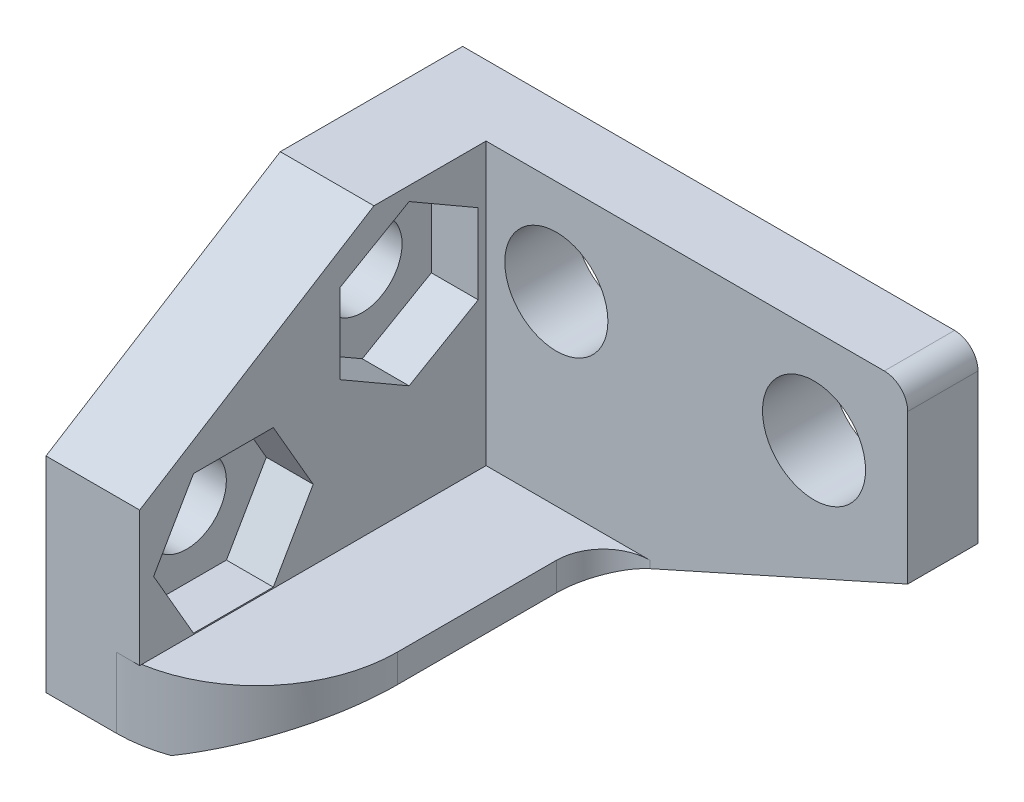
ISO-10303-21;
HEADER;
FILE_DESCRIPTION(('STEP AP214'),'2;1');
FILE_NAME('part.step','',(''),(''),'','','');
FILE_SCHEMA(('AUTOMOTIVE_DESIGN { 1 0 10303 214 1 1 1 1 }'));
ENDSEC;
DATA;
#1=APPLICATION_CONTEXT('core data for automotive mechanical design processes');
#2=APPLICATION_PROTOCOL_DEFINITION('international standard','automotive_design',2000,#1);
#3=PRODUCT_CONTEXT('',#1,'mechanical');
#4=PRODUCT('Part','Part','',(#3));
#5=PRODUCT_RELATED_PRODUCT_CATEGORY('part','',(#4));
#6=PRODUCT_DEFINITION_FORMATION('','',#4);
#7=PRODUCT_DEFINITION_CONTEXT('part definition',#1,'design');
#8=PRODUCT_DEFINITION('design','',#6,#7);
#9=PRODUCT_DEFINITION_SHAPE('','',#8);
#10=(LENGTH_UNIT() NAMED_UNIT(*) SI_UNIT(.MILLI.,.METRE.));
#11=(NAMED_UNIT(*) PLANE_ANGLE_UNIT() SI_UNIT($,.RADIAN.));
#12=(NAMED_UNIT(*) SI_UNIT($,.STERADIAN.) SOLID_ANGLE_UNIT());
#13=UNCERTAINTY_MEASURE_WITH_UNIT(LENGTH_MEASURE(1.E-05),#10,'distance_accuracy_value','');
#14=(GEOMETRIC_REPRESENTATION_CONTEXT(3) GLOBAL_UNCERTAINTY_ASSIGNED_CONTEXT((#13)) GLOBAL_UNIT_ASSIGNED_CONTEXT((#10,
#11,#12)) REPRESENTATION_CONTEXT('',''));
#15=CARTESIAN_POINT('',(0.,0.,0.));
#16=DIRECTION('',(0.,0.,1.));
#17=DIRECTION('',(1.,0.,0.));
#18=AXIS2_PLACEMENT_3D('',#15,#16,#17);
#19=CARTESIAN_POINT('',(-1.76336633663367,3.93366336633664,0.));
#20=DIRECTION('',(-0.409055904092909,0.912509324514951,0.));
#21=DIRECTION('',(-0.912509324514951,-0.409055904092909,0.));
#22=AXIS2_PLACEMENT_3D('',#19,#20,#21);
#23=PLANE('',#22);
#24=DIRECTION('',(-0.912509324514951,-0.409055904092909,0.));
#25=VECTOR('',#24,1.);
#26=CARTESIAN_POINT('',(-1.76336633663367,3.93366336633664,2.));
#27=LINE('',#26,#25);
#28=CARTESIAN_POINT('',(1.99999999999999,5.62068965517242,2.));
#29=VERTEX_POINT('',#28);
#30=CARTESIAN_POINT('',(-15.,-1.99999999999999,2.));
#31=VERTEX_POINT('',#30);
#32=EDGE_CURVE('E337',#29,#31,#27,.T.);
#33=ORIENTED_EDGE('',*,*,#32,.F.);
#34=DIRECTION('',(0.,0.,-1.));
#35=VECTOR('',#34,1.);
#36=CARTESIAN_POINT('',(1.99999999999999,5.62068965517242,0.));
#37=LINE('',#36,#35);
#38=CARTESIAN_POINT('',(1.99999999999999,5.62068965517242,5.));
#39=VERTEX_POINT('',#38);
#40=EDGE_CURVE('E354',#39,#29,#37,.T.);
#41=ORIENTED_EDGE('',*,*,#40,.F.);
#42=DIRECTION('',(-0.912509324514951,-0.409055904092909,0.));
#43=VECTOR('',#42,1.);
#44=CARTESIAN_POINT('',(-1.76336633663367,3.93366336633664,5.));
#45=LINE('',#44,#43);
#46=CARTESIAN_POINT('',(-9.,0.689655172413803,5.));
#47=VERTEX_POINT('',#46);
#48=EDGE_CURVE('E366',#39,#47,#45,.T.);
#49=ORIENTED_EDGE('',*,*,#48,.T.);
#50=CARTESIAN_POINT('',(-9.,0.689655172413805,7.));
#51=DIRECTION('',(-0.409055904092909,0.912509324514951,0.));
#52=DIRECTION('',(-0.912509324514951,-0.409055904092909,0.));
#53=AXIS2_PLACEMENT_3D('',#50,#51,#52);
#54=ELLIPSE('',#53,2.1917584251132,2.);
#55=CARTESIAN_POINT('',(-11.,-0.206896551724126,7.));
#56=VERTEX_POINT('',#55);
#57=EDGE_CURVE('E400',#47,#56,#54,.T.);
#58=ORIENTED_EDGE('',*,*,#57,.T.);
#59=DIRECTION('',(0.,0.,-1.));
#60=VECTOR('',#59,1.);
#61=CARTESIAN_POINT('',(-11.,-0.206896551724126,19.7866151357743));
#62=LINE('',#61,#60);
#63=CARTESIAN_POINT('',(-11.,-0.206896551724126,13.7866151357743));
#64=VERTEX_POINT('',#63);
#65=EDGE_CURVE('E343',#64,#56,#62,.T.);
#66=ORIENTED_EDGE('',*,*,#65,.F.);
#67=CARTESIAN_POINT('',(-17.,-2.89655172413792,13.7866151357743));
#68=DIRECTION('',(-0.409055904092909,0.912509324514951,0.));
#69=DIRECTION('',(0.912509324514951,0.409055904092909,0.));
#70=AXIS2_PLACEMENT_3D('',#67,#68,#69);
#71=ELLIPSE('',#70,6.5752752753396,6.);
#72=CARTESIAN_POINT('',(-15.,-1.99999999999999,19.4434693852667));
#73=VERTEX_POINT('',#72);
#74=EDGE_CURVE('E390',#64,#73,#71,.F.);
#75=ORIENTED_EDGE('',*,*,#74,.T.);
#76=DIRECTION('',(0.,0.,1.));
#77=VECTOR('',#76,1.);
#78=CARTESIAN_POINT('',(-15.,-1.99999999999999,0.));
#79=LINE('',#78,#77);
#80=EDGE_CURVE('E369',#31,#73,#79,.T.);
#81=ORIENTED_EDGE('',*,*,#80,.F.);
#82=EDGE_LOOP('',(#33,#41,#49,#58,#66,#75,#81));
#83=FACE_BOUND('',#82,.T.);
#84=ADVANCED_FACE('F41',(#83),#23,.F.);
#85=CARTESIAN_POINT('',(2.97851411655218,13.,0.));
#86=DIRECTION('',(0.,-1.,0.));
#87=DIRECTION('',(1.,0.,0.));
#88=AXIS2_PLACEMENT_3D('',#85,#86,#87);
#89=PLANE('',#88);
#90=DIRECTION('',(0.,0.,1.));
#91=VECTOR('',#90,1.);
#92=CARTESIAN_POINT('',(-16.,13.,5.));
#93=LINE('',#92,#91);
#94=CARTESIAN_POINT('',(-16.,13.,5.));
#95=VERTEX_POINT('',#94);
#96=CARTESIAN_POINT('',(-16.,13.,9.78661513577426));
#97=VERTEX_POINT('',#96);
#98=EDGE_CURVE('E318',#95,#97,#93,.T.);
#99=ORIENTED_EDGE('',*,*,#98,.F.);
#100=DIRECTION('',(1.,0.,0.));
#101=VECTOR('',#100,1.);
#102=CARTESIAN_POINT('',(0.,13.,5.));
#103=LINE('',#102,#101);
#104=CARTESIAN_POINT('',(0.999999999999988,13.,5.));
#105=VERTEX_POINT('',#104);
#106=EDGE_CURVE('E58',#95,#105,#103,.T.);
#107=ORIENTED_EDGE('',*,*,#106,.T.);
#108=DIRECTION('',(0.,0.,1.));
#109=VECTOR('',#108,1.);
#110=CARTESIAN_POINT('',(0.999999999999988,13.,0.));
#111=LINE('',#110,#109);
#112=CARTESIAN_POINT('',(0.999999999999988,13.,2.));
#113=VERTEX_POINT('',#112);
#114=EDGE_CURVE('E378',#105,#113,#111,.F.);
#115=ORIENTED_EDGE('',*,*,#114,.T.);
#116=DIRECTION('',(1.,0.,0.));
#117=VECTOR('',#116,1.);
#118=CARTESIAN_POINT('',(2.97851411655218,13.,2.));
#119=LINE('',#118,#117);
#120=CARTESIAN_POINT('',(-20.,13.,2.));
#121=VERTEX_POINT('',#120);
#122=EDGE_CURVE('E335',#121,#113,#119,.T.);
#123=ORIENTED_EDGE('',*,*,#122,.F.);
#124=DIRECTION('',(0.,0.,1.));
#125=VECTOR('',#124,1.);
#126=CARTESIAN_POINT('',(-20.,13.,0.));
#127=LINE('',#126,#125);
#128=CARTESIAN_POINT('',(-20.,13.,9.78661513577425));
#129=VERTEX_POINT('',#128);
#130=EDGE_CURVE('E360',#121,#129,#127,.T.);
#131=ORIENTED_EDGE('',*,*,#130,.T.);
#132=DIRECTION('',(1.,0.,0.));
#133=VECTOR('',#132,1.);
#134=CARTESIAN_POINT('',(2.97851411655218,13.,9.78661513577425));
#135=LINE('',#134,#133);
#136=EDGE_CURVE('E12',#129,#97,#135,.T.);
#137=ORIENTED_EDGE('',*,*,#136,.T.);
#138=EDGE_LOOP('',(#99,#107,#115,#123,#131,#137));
#139=FACE_BOUND('',#138,.T.);
#140=ADVANCED_FACE('F418',(#139),#89,.F.);
#141=CARTESIAN_POINT('',(-20.,25.,5.));
#142=DIRECTION('',(1.,0.,0.));
#143=DIRECTION('',(0.,1.,0.));
#144=AXIS2_PLACEMENT_3D('',#141,#142,#143);
#145=PLANE('',#144);
#146=CARTESIAN_POINT('',(-20.,4.00000000000001,15.7866151357743));
#147=DIRECTION('',(-1.,0.,0.));
#148=DIRECTION('',(0.,-1.,0.));
#149=AXIS2_PLACEMENT_3D('',#146,#147,#148);
#150=CIRCLE('',#149,1.7);
#151=CARTESIAN_POINT('',(-20.,2.30000000000001,15.7866151357743));
#152=VERTEX_POINT('',#151);
#153=EDGE_CURVE('E499',#152,#152,#150,.T.);
#154=ORIENTED_EDGE('',*,*,#153,.F.);
#155=EDGE_LOOP('',(#154));
#156=FACE_BOUND('',#155,.T.);
#157=CARTESIAN_POINT('',(-20.,9.00000000000001,8.28661513577429));
#158=DIRECTION('',(-1.,0.,0.));
#159=DIRECTION('',(0.,-1.,0.));
#160=AXIS2_PLACEMENT_3D('',#157,#158,#159);
#161=CIRCLE('',#160,1.7);
#162=CARTESIAN_POINT('',(-20.,7.30000000000001,8.28661513577429));
#163=VERTEX_POINT('',#162);
#164=EDGE_CURVE('E239',#163,#163,#161,.T.);
#165=ORIENTED_EDGE('',*,*,#164,.F.);
#166=EDGE_LOOP('',(#165));
#167=FACE_BOUND('',#166,.T.);
#168=DIRECTION('',(0.,-1.,0.));
#169=VECTOR('',#168,1.);
#170=CARTESIAN_POINT('',(-20.,-1.99999999999999,19.7866151357743));
#171=LINE('',#170,#169);
#172=CARTESIAN_POINT('',(-20.,6.75130648090674,19.7866151357743));
#173=VERTEX_POINT('',#172);
#174=CARTESIAN_POINT('',(-20.,-1.99999999999999,19.7866151357743));
#175=VERTEX_POINT('',#174);
#176=EDGE_CURVE('E349',#173,#175,#171,.T.);
#177=ORIENTED_EDGE('',*,*,#176,.F.);
#178=DIRECTION('',(0.,-0.529919264233203,0.848048096156427));
#179=VECTOR('',#178,1.);
#180=CARTESIAN_POINT('',(-20.,6.75130648090674,19.7866151357743));
#181=LINE('',#180,#179);
#182=EDGE_CURVE('E50',#173,#129,#181,.F.);
#183=ORIENTED_EDGE('',*,*,#182,.T.);
#184=ORIENTED_EDGE('',*,*,#130,.F.);
#185=DIRECTION('',(0.,1.,0.));
#186=VECTOR('',#185,1.);
#187=CARTESIAN_POINT('',(-20.,25.,2.));
#188=LINE('',#187,#186);
#189=CARTESIAN_POINT('',(-20.,-1.99999999999999,2.));
#190=VERTEX_POINT('',#189);
#191=EDGE_CURVE('E341',#190,#121,#188,.T.);
#192=ORIENTED_EDGE('',*,*,#191,.F.);
#193=DIRECTION('',(0.,0.,1.));
#194=VECTOR('',#193,1.);
#195=CARTESIAN_POINT('',(-20.,-1.99999999999999,0.));
#196=LINE('',#195,#194);
#197=EDGE_CURVE('E370',#190,#175,#196,.T.);
#198=ORIENTED_EDGE('',*,*,#197,.T.);
#199=EDGE_LOOP('',(#177,#183,#184,#192,#198));
#200=FACE_BOUND('',#199,.T.);
#201=ADVANCED_FACE('F411',(#156,#167,#200),#145,.F.);
#202=CARTESIAN_POINT('',(0.,-1.99999999999999,0.));
#203=DIRECTION('',(0.,1.,0.));
#204=DIRECTION('',(-1.,0.,0.));
#205=AXIS2_PLACEMENT_3D('',#202,#203,#204);
#206=PLANE('',#205);
#207=DIRECTION('',(-1.,0.,0.));
#208=VECTOR('',#207,1.);
#209=CARTESIAN_POINT('',(0.,-1.99999999999999,2.));
#210=LINE('',#209,#208);
#211=EDGE_CURVE('E339',#31,#190,#210,.T.);
#212=ORIENTED_EDGE('',*,*,#211,.F.);
#213=ORIENTED_EDGE('',*,*,#80,.T.);
#214=CARTESIAN_POINT('',(-17.,-1.99999999999999,13.7866151357743));
#215=DIRECTION('',(0.,1.,0.));
#216=DIRECTION('',(-1.,0.,0.));
#217=AXIS2_PLACEMENT_3D('',#214,#215,#216);
#218=CIRCLE('',#217,6.);
#219=CARTESIAN_POINT('',(-17.,-1.99999999999999,19.7866151357743));
#220=VERTEX_POINT('',#219);
#221=EDGE_CURVE('E393',#73,#220,#218,.F.);
#222=ORIENTED_EDGE('',*,*,#221,.T.);
#223=DIRECTION('',(1.,0.,0.));
#224=VECTOR('',#223,1.);
#225=CARTESIAN_POINT('',(-17.,-1.99999999999999,19.7866151357743));
#226=LINE('',#225,#224);
#227=EDGE_CURVE('E351',#175,#220,#226,.T.);
#228=ORIENTED_EDGE('',*,*,#227,.F.);
#229=ORIENTED_EDGE('',*,*,#197,.F.);
#230=EDGE_LOOP('',(#212,#213,#222,#228,#229));
#231=FACE_BOUND('',#230,.T.);
#232=ADVANCED_FACE('F465',(#231),#206,.F.);
#233=CARTESIAN_POINT('',(1.99999999999999,0.,10.));
#234=DIRECTION('',(1.,0.,0.));
#235=DIRECTION('',(0.,0.,-1.));
#236=AXIS2_PLACEMENT_3D('',#233,#234,#235);
#237=PLANE('',#236);
#238=ORIENTED_EDGE('',*,*,#40,.T.);
#239=DIRECTION('',(0.,1.,0.));
#240=VECTOR('',#239,1.);
#241=CARTESIAN_POINT('',(1.99999999999999,0.,2.));
#242=LINE('',#241,#240);
#243=CARTESIAN_POINT('',(1.99999999999999,12.,2.));
#244=VERTEX_POINT('',#243);
#245=EDGE_CURVE('E332',#29,#244,#242,.T.);
#246=ORIENTED_EDGE('',*,*,#245,.T.);
#247=DIRECTION('',(0.,0.,1.));
#248=VECTOR('',#247,1.);
#249=CARTESIAN_POINT('',(1.99999999999999,12.,5.));
#250=LINE('',#249,#248);
#251=CARTESIAN_POINT('',(1.99999999999999,12.,5.));
#252=VERTEX_POINT('',#251);
#253=EDGE_CURVE('E373',#244,#252,#250,.T.);
#254=ORIENTED_EDGE('',*,*,#253,.T.);
#255=DIRECTION('',(0.,1.,0.));
#256=VECTOR('',#255,1.);
#257=CARTESIAN_POINT('',(1.99999999999999,0.,5.));
#258=LINE('',#257,#256);
#259=EDGE_CURVE('E357',#39,#252,#258,.T.);
#260=ORIENTED_EDGE('',*,*,#259,.F.);
#261=EDGE_LOOP('',(#238,#246,#254,#260));
#262=FACE_BOUND('',#261,.T.);
#263=ADVANCED_FACE('F458',(#262),#237,.T.);
#264=CARTESIAN_POINT('',(0.999999999999988,12.,10.));
#265=DIRECTION('',(0.,0.,-1.));
#266=DIRECTION('',(-1.,0.,0.));
#267=AXIS2_PLACEMENT_3D('',#264,#265,#266);
#268=CYLINDRICAL_SURFACE('',#267,1.);
#269=ORIENTED_EDGE('',*,*,#253,.F.);
#270=CARTESIAN_POINT('',(0.999999999999988,12.,2.));
#271=DIRECTION('',(0.,0.,-1.));
#272=DIRECTION('',(-1.,0.,0.));
#273=AXIS2_PLACEMENT_3D('',#270,#271,#272);
#274=CIRCLE('',#273,1.);
#275=EDGE_CURVE('E329',#244,#113,#274,.F.);
#276=ORIENTED_EDGE('',*,*,#275,.T.);
#277=ORIENTED_EDGE('',*,*,#114,.F.);
#278=CARTESIAN_POINT('',(0.999999999999988,12.,5.));
#279=DIRECTION('',(0.,0.,1.));
#280=DIRECTION('',(1.,0.,0.));
#281=AXIS2_PLACEMENT_3D('',#278,#279,#280);
#282=CIRCLE('',#281,1.);
#283=EDGE_CURVE('E376',#252,#105,#282,.T.);
#284=ORIENTED_EDGE('',*,*,#283,.F.);
#285=EDGE_LOOP('',(#269,#276,#277,#284));
#286=FACE_BOUND('',#285,.T.);
#287=ADVANCED_FACE('F468',(#286),#268,.T.);
#288=CARTESIAN_POINT('',(0.,0.,5.));
#289=DIRECTION('',(0.,0.,1.));
#290=DIRECTION('',(1.,0.,0.));
#291=AXIS2_PLACEMENT_3D('',#288,#289,#290);
#292=PLANE('',#291);
#293=CARTESIAN_POINT('',(-13.,8.93226907062247,5.));
#294=DIRECTION('',(0.,0.,1.));
#295=DIRECTION('',(1.,0.,0.));
#296=AXIS2_PLACEMENT_3D('',#293,#294,#295);
#297=CIRCLE('',#296,2.2);
#298=CARTESIAN_POINT('',(-10.8,8.93226907062247,5.));
#299=VERTEX_POINT('',#298);
#300=EDGE_CURVE('E514',#299,#299,#297,.T.);
#301=ORIENTED_EDGE('',*,*,#300,.F.);
#302=EDGE_LOOP('',(#301));
#303=FACE_BOUND('',#302,.T.);
#304=CARTESIAN_POINT('',(-2.00000000000001,8.93226907062247,5.));
#305=DIRECTION('',(0.,0.,1.));
#306=DIRECTION('',(1.,0.,0.));
#307=AXIS2_PLACEMENT_3D('',#304,#305,#306);
#308=CIRCLE('',#307,2.2);
#309=CARTESIAN_POINT('',(0.199999999999988,8.93226907062247,5.));
#310=VERTEX_POINT('',#309);
#311=EDGE_CURVE('E506',#310,#310,#308,.T.);
#312=ORIENTED_EDGE('',*,*,#311,.F.);
#313=EDGE_LOOP('',(#312));
#314=FACE_BOUND('',#313,.T.);
#315=DIRECTION('',(0.,1.,0.));
#316=VECTOR('',#315,1.);
#317=CARTESIAN_POINT('',(-16.,1.00000000000001,5.));
#318=LINE('',#317,#316);
#319=CARTESIAN_POINT('',(-16.,1.00000000000001,5.));
#320=VERTEX_POINT('',#319);
#321=EDGE_CURVE('E62',#320,#95,#318,.T.);
#322=ORIENTED_EDGE('',*,*,#321,.F.);
#323=DIRECTION('',(-1.,0.,0.));
#324=VECTOR('',#323,1.);
#325=CARTESIAN_POINT('',(0.,1.00000000000001,5.));
#326=LINE('',#325,#324);
#327=CARTESIAN_POINT('',(-9.,1.00000000000001,5.));
#328=VERTEX_POINT('',#327);
#329=EDGE_CURVE('E364',#328,#320,#326,.T.);
#330=ORIENTED_EDGE('',*,*,#329,.F.);
#331=DIRECTION('',(0.,-1.,0.));
#332=VECTOR('',#331,1.);
#333=CARTESIAN_POINT('',(-9.,0.,5.));
#334=LINE('',#333,#332);
#335=EDGE_CURVE('E395',#328,#47,#334,.T.);
#336=ORIENTED_EDGE('',*,*,#335,.T.);
#337=ORIENTED_EDGE('',*,*,#48,.F.);
#338=ORIENTED_EDGE('',*,*,#259,.T.);
#339=ORIENTED_EDGE('',*,*,#283,.T.);
#340=ORIENTED_EDGE('',*,*,#106,.F.);
#341=EDGE_LOOP('',(#322,#330,#336,#337,#338,#339,#340));
#342=FACE_BOUND('',#341,.T.);
#343=ADVANCED_FACE('F454',(#303,#314,#342),#292,.T.);
#344=CARTESIAN_POINT('',(0.,1.00000000000001,15.));
#345=DIRECTION('',(0.,-1.,0.));
#346=DIRECTION('',(1.,0.,0.));
#347=AXIS2_PLACEMENT_3D('',#344,#345,#346);
#348=PLANE('',#347);
#349=ORIENTED_EDGE('',*,*,#329,.T.);
#350=DIRECTION('',(0.,0.,-1.));
#351=VECTOR('',#350,1.);
#352=CARTESIAN_POINT('',(-16.,1.00000000000001,19.7866151357743));
#353=LINE('',#352,#351);
#354=CARTESIAN_POINT('',(-16.,1.00000000000001,19.7026949188739));
#355=VERTEX_POINT('',#354);
#356=EDGE_CURVE('E313',#355,#320,#353,.T.);
#357=ORIENTED_EDGE('',*,*,#356,.F.);
#358=CARTESIAN_POINT('',(-17.,1.00000000000001,13.7866151357743));
#359=DIRECTION('',(0.,-1.,0.));
#360=DIRECTION('',(1.,0.,0.));
#361=AXIS2_PLACEMENT_3D('',#358,#359,#360);
#362=CIRCLE('',#361,6.);
#363=CARTESIAN_POINT('',(-11.,1.00000000000001,13.7866151357743));
#364=VERTEX_POINT('',#363);
#365=EDGE_CURVE('E384',#355,#364,#362,.F.);
#366=ORIENTED_EDGE('',*,*,#365,.T.);
#367=DIRECTION('',(0.,0.,1.));
#368=VECTOR('',#367,1.);
#369=CARTESIAN_POINT('',(-11.,1.00000000000001,0.));
#370=LINE('',#369,#368);
#371=CARTESIAN_POINT('',(-11.,1.00000000000001,7.));
#372=VERTEX_POINT('',#371);
#373=EDGE_CURVE('E346',#372,#364,#370,.T.);
#374=ORIENTED_EDGE('',*,*,#373,.F.);
#375=CARTESIAN_POINT('',(-9.,1.00000000000001,7.));
#376=DIRECTION('',(0.,-1.,0.));
#377=DIRECTION('',(1.,0.,0.));
#378=AXIS2_PLACEMENT_3D('',#375,#376,#377);
#379=CIRCLE('',#378,2.);
#380=EDGE_CURVE('E402',#372,#328,#379,.T.);
#381=ORIENTED_EDGE('',*,*,#380,.T.);
#382=EDGE_LOOP('',(#349,#357,#366,#374,#381));
#383=FACE_BOUND('',#382,.T.);
#384=ADVANCED_FACE('F434',(#383),#348,.F.);
#385=CARTESIAN_POINT('',(0.,0.,19.7866151357743));
#386=DIRECTION('',(0.,0.,-1.));
#387=DIRECTION('',(-1.,0.,0.));
#388=AXIS2_PLACEMENT_3D('',#385,#386,#387);
#389=PLANE('',#388);
#390=DIRECTION('',(0.,1.,0.));
#391=VECTOR('',#390,1.);
#392=CARTESIAN_POINT('',(-17.,0.,19.7866151357743));
#393=LINE('',#392,#391);
#394=CARTESIAN_POINT('',(-17.,1.00000000000001,19.7866151357743));
#395=VERTEX_POINT('',#394);
#396=EDGE_CURVE('E381',#220,#395,#393,.T.);
#397=ORIENTED_EDGE('',*,*,#396,.T.);
#398=DIRECTION('',(-1.,0.,0.));
#399=VECTOR('',#398,1.);
#400=CARTESIAN_POINT('',(-16.,1.00000000000001,19.7866151357743));
#401=LINE('',#400,#399);
#402=CARTESIAN_POINT('',(-16.,1.00000000000001,19.7866151357743));
#403=VERTEX_POINT('',#402);
#404=EDGE_CURVE('E326',#403,#395,#401,.T.);
#405=ORIENTED_EDGE('',*,*,#404,.F.);
#406=DIRECTION('',(0.,-1.,0.));
#407=VECTOR('',#406,1.);
#408=CARTESIAN_POINT('',(-16.,6.75130648090674,19.7866151357743));
#409=LINE('',#408,#407);
#410=CARTESIAN_POINT('',(-16.,6.75130648090674,19.7866151357743));
#411=VERTEX_POINT('',#410);
#412=EDGE_CURVE('E324',#411,#403,#409,.T.);
#413=ORIENTED_EDGE('',*,*,#412,.F.);
#414=DIRECTION('',(-1.,0.,0.));
#415=VECTOR('',#414,1.);
#416=CARTESIAN_POINT('',(0.,6.75130648090674,19.7866151357743));
#417=LINE('',#416,#415);
#418=EDGE_CURVE('E405',#411,#173,#417,.T.);
#419=ORIENTED_EDGE('',*,*,#418,.T.);
#420=ORIENTED_EDGE('',*,*,#176,.T.);
#421=ORIENTED_EDGE('',*,*,#227,.T.);
#422=EDGE_LOOP('',(#397,#405,#413,#419,#420,#421));
#423=FACE_BOUND('',#422,.T.);
#424=ADVANCED_FACE('F426',(#423),#389,.F.);
#425=CARTESIAN_POINT('',(-11.,-17.9575683352292,0.));
#426=DIRECTION('',(-1.,0.,0.));
#427=DIRECTION('',(0.,-1.,0.));
#428=AXIS2_PLACEMENT_3D('',#425,#426,#427);
#429=PLANE('',#428);
#430=ORIENTED_EDGE('',*,*,#65,.T.);
#431=DIRECTION('',(0.,-1.,0.));
#432=VECTOR('',#431,1.);
#433=CARTESIAN_POINT('',(-11.,-17.9575683352292,7.));
#434=LINE('',#433,#432);
#435=EDGE_CURVE('E398',#56,#372,#434,.F.);
#436=ORIENTED_EDGE('',*,*,#435,.T.);
#437=ORIENTED_EDGE('',*,*,#373,.T.);
#438=DIRECTION('',(0.,1.,0.));
#439=VECTOR('',#438,1.);
#440=CARTESIAN_POINT('',(-11.,-17.9575683352292,13.7866151357743));
#441=LINE('',#440,#439);
#442=EDGE_CURVE('E388',#364,#64,#441,.F.);
#443=ORIENTED_EDGE('',*,*,#442,.T.);
#444=EDGE_LOOP('',(#430,#436,#437,#443));
#445=FACE_BOUND('',#444,.T.);
#446=ADVANCED_FACE('F443',(#445),#429,.F.);
#447=CARTESIAN_POINT('',(-17.,0.,13.7866151357743));
#448=DIRECTION('',(0.,1.,0.));
#449=DIRECTION('',(-1.,0.,0.));
#450=AXIS2_PLACEMENT_3D('',#447,#448,#449);
#451=CYLINDRICAL_SURFACE('',#450,6.);
#452=ORIENTED_EDGE('',*,*,#74,.F.);
#453=ORIENTED_EDGE('',*,*,#442,.F.);
#454=ORIENTED_EDGE('',*,*,#365,.F.);
#455=EDGE_CURVE('E385',#395,#355,#362,.F.);
#456=ORIENTED_EDGE('',*,*,#455,.F.);
#457=ORIENTED_EDGE('',*,*,#396,.F.);
#458=ORIENTED_EDGE('',*,*,#221,.F.);
#459=EDGE_LOOP('',(#452,#453,#454,#456,#457,#458));
#460=FACE_BOUND('',#459,.T.);
#461=ADVANCED_FACE('F439',(#460),#451,.T.);
#462=CARTESIAN_POINT('',(-9.,0.,7.));
#463=DIRECTION('',(0.,-1.,0.));
#464=DIRECTION('',(1.,0.,0.));
#465=AXIS2_PLACEMENT_3D('',#462,#463,#464);
#466=CYLINDRICAL_SURFACE('',#465,2.);
#467=ORIENTED_EDGE('',*,*,#380,.F.);
#468=ORIENTED_EDGE('',*,*,#435,.F.);
#469=ORIENTED_EDGE('',*,*,#57,.F.);
#470=ORIENTED_EDGE('',*,*,#335,.F.);
#471=EDGE_LOOP('',(#467,#468,#469,#470));
#472=FACE_BOUND('',#471,.T.);
#473=ADVANCED_FACE('F453',(#472),#466,.F.);
#474=CARTESIAN_POINT('',(0.,0.,2.));
#475=DIRECTION('',(0.,0.,-1.));
#476=DIRECTION('',(-1.,0.,0.));
#477=AXIS2_PLACEMENT_3D('',#474,#475,#476);
#478=PLANE('',#477);
#479=CARTESIAN_POINT('',(-13.,8.93226907062247,2.));
#480=DIRECTION('',(0.,0.,-1.));
#481=DIRECTION('',(-1.,0.,0.));
#482=AXIS2_PLACEMENT_3D('',#479,#480,#481);
#483=CIRCLE('',#482,2.2);
#484=CARTESIAN_POINT('',(-15.2,8.93226907062247,2.));
#485=VERTEX_POINT('',#484);
#486=EDGE_CURVE('E517',#485,#485,#483,.T.);
#487=ORIENTED_EDGE('',*,*,#486,.F.);
#488=EDGE_LOOP('',(#487));
#489=FACE_BOUND('',#488,.T.);
#490=CARTESIAN_POINT('',(-2.00000000000001,8.93226907062247,2.));
#491=DIRECTION('',(0.,0.,-1.));
#492=DIRECTION('',(-1.,0.,0.));
#493=AXIS2_PLACEMENT_3D('',#490,#491,#492);
#494=CIRCLE('',#493,2.2);
#495=CARTESIAN_POINT('',(-4.20000000000001,8.93226907062247,2.));
#496=VERTEX_POINT('',#495);
#497=EDGE_CURVE('E509',#496,#496,#494,.T.);
#498=ORIENTED_EDGE('',*,*,#497,.F.);
#499=EDGE_LOOP('',(#498));
#500=FACE_BOUND('',#499,.T.);
#501=ORIENTED_EDGE('',*,*,#191,.T.);
#502=ORIENTED_EDGE('',*,*,#122,.T.);
#503=ORIENTED_EDGE('',*,*,#275,.F.);
#504=ORIENTED_EDGE('',*,*,#245,.F.);
#505=ORIENTED_EDGE('',*,*,#32,.T.);
#506=ORIENTED_EDGE('',*,*,#211,.T.);
#507=EDGE_LOOP('',(#501,#502,#503,#504,#505,#506));
#508=FACE_BOUND('',#507,.T.);
#509=ADVANCED_FACE('F462',(#489,#500,#508),#478,.T.);
#510=CARTESIAN_POINT('',(0.,6.75130648090674,19.7866151357743));
#511=DIRECTION('',(0.,-0.848048096156427,-0.529919264233203));
#512=DIRECTION('',(-1.,0.,0.));
#513=AXIS2_PLACEMENT_3D('',#510,#511,#512);
#514=PLANE('',#513);
#515=ORIENTED_EDGE('',*,*,#418,.F.);
#516=DIRECTION('',(0.,-0.529919264233203,0.848048096156427));
#517=VECTOR('',#516,1.);
#518=CARTESIAN_POINT('',(-16.,13.,9.78661513577426));
#519=LINE('',#518,#517);
#520=EDGE_CURVE('E321',#97,#411,#519,.T.);
#521=ORIENTED_EDGE('',*,*,#520,.F.);
#522=ORIENTED_EDGE('',*,*,#136,.F.);
#523=ORIENTED_EDGE('',*,*,#182,.F.);
#524=EDGE_LOOP('',(#515,#521,#522,#523));
#525=FACE_BOUND('',#524,.T.);
#526=ADVANCED_FACE('F43',(#525),#514,.F.);
#527=CARTESIAN_POINT('',(-16.,0.,0.));
#528=DIRECTION('',(1.,0.,0.));
#529=DIRECTION('',(0.,0.,-1.));
#530=AXIS2_PLACEMENT_3D('',#527,#528,#529);
#531=PLANE('',#530);
#532=EDGE_CURVE('E314',#403,#355,#353,.T.);
#533=ORIENTED_EDGE('',*,*,#532,.T.);
#534=ORIENTED_EDGE('',*,*,#356,.T.);
#535=ORIENTED_EDGE('',*,*,#321,.T.);
#536=ORIENTED_EDGE('',*,*,#98,.T.);
#537=ORIENTED_EDGE('',*,*,#520,.T.);
#538=ORIENTED_EDGE('',*,*,#412,.T.);
#539=EDGE_LOOP('',(#533,#534,#535,#536,#537,#538));
#540=FACE_BOUND('',#539,.T.);
#541=DIRECTION('',(0.,-0.5,-0.866025403784439));
#542=VECTOR('',#541,1.);
#543=CARTESIAN_POINT('',(-16.,7.29681670589061,11.2366151357743));
#544=LINE('',#543,#542);
#545=CARTESIAN_POINT('',(-16.,7.29681670589061,11.2366151357743));
#546=VERTEX_POINT('',#545);
#547=CARTESIAN_POINT('',(-16.,5.59363341178122,8.28661513577429));
#548=VERTEX_POINT('',#547);
#549=EDGE_CURVE('E290',#546,#548,#544,.T.);
#550=ORIENTED_EDGE('',*,*,#549,.F.);
#551=DIRECTION('',(0.,-1.,0.));
#552=VECTOR('',#551,1.);
#553=CARTESIAN_POINT('',(-16.,10.7031832941094,11.2366151357743));
#554=LINE('',#553,#552);
#555=CARTESIAN_POINT('',(-16.,10.7031832941094,11.2366151357743));
#556=VERTEX_POINT('',#555);
#557=EDGE_CURVE('E288',#556,#546,#554,.T.);
#558=ORIENTED_EDGE('',*,*,#557,.F.);
#559=DIRECTION('',(0.,-0.5,0.866025403784439));
#560=VECTOR('',#559,1.);
#561=CARTESIAN_POINT('',(-16.,12.4063665882188,8.28661513577429));
#562=LINE('',#561,#560);
#563=CARTESIAN_POINT('',(-16.,12.4063665882188,8.28661513577429));
#564=VERTEX_POINT('',#563);
#565=EDGE_CURVE('E299',#564,#556,#562,.T.);
#566=ORIENTED_EDGE('',*,*,#565,.F.);
#567=DIRECTION('',(0.,0.5,0.866025403784438));
#568=VECTOR('',#567,1.);
#569=CARTESIAN_POINT('',(-16.,10.7031832941094,5.33661513577429));
#570=LINE('',#569,#568);
#571=CARTESIAN_POINT('',(-16.,10.7031832941094,5.33661513577429));
#572=VERTEX_POINT('',#571);
#573=EDGE_CURVE('E296',#572,#564,#570,.T.);
#574=ORIENTED_EDGE('',*,*,#573,.F.);
#575=DIRECTION('',(0.,1.,0.));
#576=VECTOR('',#575,1.);
#577=CARTESIAN_POINT('',(-16.,7.29681670589061,5.33661513577429));
#578=LINE('',#577,#576);
#579=CARTESIAN_POINT('',(-16.,7.29681670589061,5.33661513577429));
#580=VERTEX_POINT('',#579);
#581=EDGE_CURVE('E294',#580,#572,#578,.T.);
#582=ORIENTED_EDGE('',*,*,#581,.F.);
#583=DIRECTION('',(0.,0.5,-0.866025403784439));
#584=VECTOR('',#583,1.);
#585=CARTESIAN_POINT('',(-16.,5.59363341178122,8.28661513577429));
#586=LINE('',#585,#584);
#587=EDGE_CURVE('E292',#548,#580,#586,.T.);
#588=ORIENTED_EDGE('',*,*,#587,.F.);
#589=EDGE_LOOP('',(#550,#558,#566,#574,#582,#588));
#590=FACE_BOUND('',#589,.T.);
#591=DIRECTION('',(0.,0.,-1.));
#592=VECTOR('',#591,1.);
#593=CARTESIAN_POINT('',(-16.,1.05000000000001,17.4897984298837));
#594=LINE('',#593,#592);
#595=CARTESIAN_POINT('',(-16.,1.05000000000001,17.4897984298837));
#596=VERTEX_POINT('',#595);
#597=CARTESIAN_POINT('',(-16.,1.05000000000001,14.0834318416649));
#598=VERTEX_POINT('',#597);
#599=EDGE_CURVE('E270',#596,#598,#594,.T.);
#600=ORIENTED_EDGE('',*,*,#599,.F.);
#601=DIRECTION('',(0.,-0.866025403784439,-0.499999999999999));
#602=VECTOR('',#601,1.);
#603=CARTESIAN_POINT('',(-16.,4.00000000000001,19.1929817239931));
#604=LINE('',#603,#602);
#605=CARTESIAN_POINT('',(-16.,4.00000000000001,19.1929817239931));
#606=VERTEX_POINT('',#605);
#607=EDGE_CURVE('E268',#606,#596,#604,.T.);
#608=ORIENTED_EDGE('',*,*,#607,.F.);
#609=DIRECTION('',(0.,-0.866025403784439,0.5));
#610=VECTOR('',#609,1.);
#611=CARTESIAN_POINT('',(-16.,6.95000000000001,17.4897984298837));
#612=LINE('',#611,#610);
#613=CARTESIAN_POINT('',(-16.,6.95000000000001,17.4897984298837));
#614=VERTEX_POINT('',#613);
#615=EDGE_CURVE('E217',#614,#606,#612,.T.);
#616=ORIENTED_EDGE('',*,*,#615,.F.);
#617=DIRECTION('',(0.,0.,1.));
#618=VECTOR('',#617,1.);
#619=CARTESIAN_POINT('',(-16.,6.95000000000001,14.0834318416649));
#620=LINE('',#619,#618);
#621=CARTESIAN_POINT('',(-16.,6.95000000000001,14.0834318416649));
#622=VERTEX_POINT('',#621);
#623=EDGE_CURVE('E276',#622,#614,#620,.T.);
#624=ORIENTED_EDGE('',*,*,#623,.F.);
#625=DIRECTION('',(0.,0.866025403784439,0.5));
#626=VECTOR('',#625,1.);
#627=CARTESIAN_POINT('',(-16.,4.00000000000001,12.3802485475555));
#628=LINE('',#627,#626);
#629=CARTESIAN_POINT('',(-16.,4.00000000000001,12.3802485475555));
#630=VERTEX_POINT('',#629);
#631=EDGE_CURVE('E274',#630,#622,#628,.T.);
#632=ORIENTED_EDGE('',*,*,#631,.F.);
#633=DIRECTION('',(0.,0.866025403784439,-0.5));
#634=VECTOR('',#633,1.);
#635=CARTESIAN_POINT('',(-16.,1.05000000000001,14.0834318416649));
#636=LINE('',#635,#634);
#637=EDGE_CURVE('E272',#598,#630,#636,.T.);
#638=ORIENTED_EDGE('',*,*,#637,.F.);
#639=EDGE_LOOP('',(#600,#608,#616,#624,#632,#638));
#640=FACE_BOUND('',#639,.T.);
#641=ADVANCED_FACE('F422',(#540,#590,#640),#531,.T.);
#642=CARTESIAN_POINT('',(-16.,1.00000000000001,19.7866151357743));
#643=DIRECTION('',(0.,1.,0.));
#644=DIRECTION('',(-1.,0.,0.));
#645=AXIS2_PLACEMENT_3D('',#642,#643,#644);
#646=PLANE('',#645);
#647=ORIENTED_EDGE('',*,*,#455,.T.);
#648=ORIENTED_EDGE('',*,*,#532,.F.);
#649=ORIENTED_EDGE('',*,*,#404,.T.);
#650=EDGE_LOOP('',(#647,#648,#649));
#651=FACE_BOUND('',#650,.T.);
#652=ADVANCED_FACE('F430',(#651),#646,.F.);
#653=CARTESIAN_POINT('',(-16.,10.7031832941094,11.2366151357743));
#654=DIRECTION('',(0.,0.,-1.));
#655=DIRECTION('',(-1.,0.,0.));
#656=AXIS2_PLACEMENT_3D('',#653,#654,#655);
#657=PLANE('',#656);
#658=DIRECTION('',(-1.,0.,0.));
#659=VECTOR('',#658,1.);
#660=CARTESIAN_POINT('',(-16.,7.29681670589061,11.2366151357743));
#661=LINE('',#660,#659);
#662=CARTESIAN_POINT('',(-18.,7.29681670589061,11.2366151357743));
#663=VERTEX_POINT('',#662);
#664=EDGE_CURVE('E311',#546,#663,#661,.T.);
#665=ORIENTED_EDGE('',*,*,#664,.T.);
#666=DIRECTION('',(0.,-1.,0.));
#667=VECTOR('',#666,1.);
#668=CARTESIAN_POINT('',(-18.,10.7031832941094,11.2366151357743));
#669=LINE('',#668,#667);
#670=CARTESIAN_POINT('',(-18.,10.7031832941094,11.2366151357743));
#671=VERTEX_POINT('',#670);
#672=EDGE_CURVE('E250',#671,#663,#669,.T.);
#673=ORIENTED_EDGE('',*,*,#672,.F.);
#674=DIRECTION('',(-1.,0.,0.));
#675=VECTOR('',#674,1.);
#676=CARTESIAN_POINT('',(-16.,10.7031832941094,11.2366151357743));
#677=LINE('',#676,#675);
#678=EDGE_CURVE('E301',#556,#671,#677,.T.);
#679=ORIENTED_EDGE('',*,*,#678,.F.);
#680=ORIENTED_EDGE('',*,*,#557,.T.);
#681=EDGE_LOOP('',(#665,#673,#679,#680));
#682=FACE_BOUND('',#681,.T.);
#683=ADVANCED_FACE('F591',(#682),#657,.T.);
#684=CARTESIAN_POINT('',(-16.,7.29681670589061,11.2366151357743));
#685=DIRECTION('',(0.,0.866025403784439,-0.5));
#686=DIRECTION('',(0.,0.5,0.866025403784439));
#687=AXIS2_PLACEMENT_3D('',#684,#685,#686);
#688=PLANE('',#687);
#689=DIRECTION('',(-1.,0.,0.));
#690=VECTOR('',#689,1.);
#691=CARTESIAN_POINT('',(-16.,5.59363341178122,8.28661513577429));
#692=LINE('',#691,#690);
#693=CARTESIAN_POINT('',(-18.,5.59363341178122,8.28661513577428));
#694=VERTEX_POINT('',#693);
#695=EDGE_CURVE('E309',#548,#694,#692,.T.);
#696=ORIENTED_EDGE('',*,*,#695,.T.);
#697=DIRECTION('',(0.,-0.499999999999999,-0.866025403784439));
#698=VECTOR('',#697,1.);
#699=CARTESIAN_POINT('',(-18.,7.29681670589061,11.2366151357743));
#700=LINE('',#699,#698);
#701=EDGE_CURVE('E253',#663,#694,#700,.T.);
#702=ORIENTED_EDGE('',*,*,#701,.F.);
#703=ORIENTED_EDGE('',*,*,#664,.F.);
#704=ORIENTED_EDGE('',*,*,#549,.T.);
#705=EDGE_LOOP('',(#696,#702,#703,#704));
#706=FACE_BOUND('',#705,.T.);
#707=ADVANCED_FACE('F587',(#706),#688,.T.);
#708=CARTESIAN_POINT('',(-16.,5.59363341178122,8.28661513577429));
#709=DIRECTION('',(0.,0.866025403784439,0.5));
#710=DIRECTION('',(0.,-0.5,0.866025403784439));
#711=AXIS2_PLACEMENT_3D('',#708,#709,#710);
#712=PLANE('',#711);
#713=DIRECTION('',(-1.,0.,0.));
#714=VECTOR('',#713,1.);
#715=CARTESIAN_POINT('',(-16.,7.29681670589061,5.33661513577429));
#716=LINE('',#715,#714);
#717=CARTESIAN_POINT('',(-18.,7.29681670589063,5.33661513577428));
#718=VERTEX_POINT('',#717);
#719=EDGE_CURVE('E307',#580,#718,#716,.T.);
#720=ORIENTED_EDGE('',*,*,#719,.T.);
#721=DIRECTION('',(0.,0.500000000000003,-0.866025403784437));
#722=VECTOR('',#721,1.);
#723=CARTESIAN_POINT('',(-18.,5.59363341178122,8.28661513577428));
#724=LINE('',#723,#722);
#725=EDGE_CURVE('E256',#694,#718,#724,.T.);
#726=ORIENTED_EDGE('',*,*,#725,.F.);
#727=ORIENTED_EDGE('',*,*,#695,.F.);
#728=ORIENTED_EDGE('',*,*,#587,.T.);
#729=EDGE_LOOP('',(#720,#726,#727,#728));
#730=FACE_BOUND('',#729,.T.);
#731=ADVANCED_FACE('F583',(#730),#712,.T.);
#732=CARTESIAN_POINT('',(-16.,7.29681670589061,5.33661513577429));
#733=DIRECTION('',(0.,0.,1.));
#734=DIRECTION('',(1.,0.,0.));
#735=AXIS2_PLACEMENT_3D('',#732,#733,#734);
#736=PLANE('',#735);
#737=DIRECTION('',(-1.,0.,0.));
#738=VECTOR('',#737,1.);
#739=CARTESIAN_POINT('',(-16.,10.7031832941094,5.33661513577429));
#740=LINE('',#739,#738);
#741=CARTESIAN_POINT('',(-18.,10.7031832941094,5.3366151357743));
#742=VERTEX_POINT('',#741);
#743=EDGE_CURVE('E305',#572,#742,#740,.T.);
#744=ORIENTED_EDGE('',*,*,#743,.T.);
#745=DIRECTION('',(0.,1.,0.));
#746=VECTOR('',#745,1.);
#747=CARTESIAN_POINT('',(-18.,7.29681670589063,5.33661513577428));
#748=LINE('',#747,#746);
#749=EDGE_CURVE('E259',#718,#742,#748,.T.);
#750=ORIENTED_EDGE('',*,*,#749,.F.);
#751=ORIENTED_EDGE('',*,*,#719,.F.);
#752=ORIENTED_EDGE('',*,*,#581,.T.);
#753=EDGE_LOOP('',(#744,#750,#751,#752));
#754=FACE_BOUND('',#753,.T.);
#755=ADVANCED_FACE('F579',(#754),#736,.T.);
#756=CARTESIAN_POINT('',(-16.,10.7031832941094,5.33661513577429));
#757=DIRECTION('',(0.,-0.866025403784438,0.5));
#758=DIRECTION('',(0.,-0.5,-0.866025403784438));
#759=AXIS2_PLACEMENT_3D('',#756,#757,#758);
#760=PLANE('',#759);
#761=DIRECTION('',(-1.,0.,0.));
#762=VECTOR('',#761,1.);
#763=CARTESIAN_POINT('',(-16.,12.4063665882188,8.28661513577429));
#764=LINE('',#763,#762);
#765=CARTESIAN_POINT('',(-18.,12.4063665882188,8.28661513577432));
#766=VERTEX_POINT('',#765);
#767=EDGE_CURVE('E303',#564,#766,#764,.T.);
#768=ORIENTED_EDGE('',*,*,#767,.T.);
#769=DIRECTION('',(0.,0.499999999999993,0.866025403784443));
#770=VECTOR('',#769,1.);
#771=CARTESIAN_POINT('',(-18.,10.7031832941094,5.3366151357743));
#772=LINE('',#771,#770);
#773=EDGE_CURVE('E262',#742,#766,#772,.T.);
#774=ORIENTED_EDGE('',*,*,#773,.F.);
#775=ORIENTED_EDGE('',*,*,#743,.F.);
#776=ORIENTED_EDGE('',*,*,#573,.T.);
#777=EDGE_LOOP('',(#768,#774,#775,#776));
#778=FACE_BOUND('',#777,.T.);
#779=ADVANCED_FACE('F575',(#778),#760,.T.);
#780=CARTESIAN_POINT('',(-16.,12.4063665882188,8.28661513577429));
#781=DIRECTION('',(0.,-0.866025403784439,-0.5));
#782=DIRECTION('',(0.,0.5,-0.866025403784439));
#783=AXIS2_PLACEMENT_3D('',#780,#781,#782);
#784=PLANE('',#783);
#785=ORIENTED_EDGE('',*,*,#678,.T.);
#786=DIRECTION('',(0.,-0.500000000000009,0.866025403784433));
#787=VECTOR('',#786,1.);
#788=CARTESIAN_POINT('',(-18.,12.4063665882188,8.28661513577432));
#789=LINE('',#788,#787);
#790=EDGE_CURVE('E265',#766,#671,#789,.T.);
#791=ORIENTED_EDGE('',*,*,#790,.F.);
#792=ORIENTED_EDGE('',*,*,#767,.F.);
#793=ORIENTED_EDGE('',*,*,#565,.T.);
#794=EDGE_LOOP('',(#785,#791,#792,#793));
#795=FACE_BOUND('',#794,.T.);
#796=ADVANCED_FACE('F572',(#795),#784,.T.);
#797=CARTESIAN_POINT('',(-16.,4.00000000000001,19.1929817239931));
#798=DIRECTION('',(0.,0.5,-0.866025403784439));
#799=DIRECTION('',(0.,0.866025403784439,0.499999999999999));
#800=AXIS2_PLACEMENT_3D('',#797,#798,#799);
#801=PLANE('',#800);
#802=DIRECTION('',(-1.,0.,0.));
#803=VECTOR('',#802,1.);
#804=CARTESIAN_POINT('',(-16.,1.05000000000001,17.4897984298837));
#805=LINE('',#804,#803);
#806=CARTESIAN_POINT('',(-18.,1.05000000000001,17.4897984298837));
#807=VERTEX_POINT('',#806);
#808=EDGE_CURVE('E226',#596,#807,#805,.T.);
#809=ORIENTED_EDGE('',*,*,#808,.T.);
#810=DIRECTION('',(0.,-0.866025403784439,-0.5));
#811=VECTOR('',#810,1.);
#812=CARTESIAN_POINT('',(-18.,4.00000000000001,19.1929817239931));
#813=LINE('',#812,#811);
#814=CARTESIAN_POINT('',(-18.,4.00000000000001,19.1929817239931));
#815=VERTEX_POINT('',#814);
#816=EDGE_CURVE('E223',#815,#807,#813,.T.);
#817=ORIENTED_EDGE('',*,*,#816,.F.);
#818=DIRECTION('',(-1.,0.,0.));
#819=VECTOR('',#818,1.);
#820=CARTESIAN_POINT('',(-16.,4.00000000000001,19.1929817239931));
#821=LINE('',#820,#819);
#822=EDGE_CURVE('E210',#606,#815,#821,.T.);
#823=ORIENTED_EDGE('',*,*,#822,.F.);
#824=ORIENTED_EDGE('',*,*,#607,.T.);
#825=EDGE_LOOP('',(#809,#817,#823,#824));
#826=FACE_BOUND('',#825,.T.);
#827=ADVANCED_FACE('F224',(#826),#801,.T.);
#828=CARTESIAN_POINT('',(-16.,1.05000000000001,17.4897984298837));
#829=DIRECTION('',(0.,1.,0.));
#830=DIRECTION('',(0.,0.,1.));
#831=AXIS2_PLACEMENT_3D('',#828,#829,#830);
#832=PLANE('',#831);
#833=DIRECTION('',(-1.,0.,0.));
#834=VECTOR('',#833,1.);
#835=CARTESIAN_POINT('',(-16.,1.05000000000001,14.0834318416649));
#836=LINE('',#835,#834);
#837=CARTESIAN_POINT('',(-18.,1.05000000000002,14.0834318416649));
#838=VERTEX_POINT('',#837);
#839=EDGE_CURVE('E285',#598,#838,#836,.T.);
#840=ORIENTED_EDGE('',*,*,#839,.T.);
#841=DIRECTION('',(0.,0.,-1.));
#842=VECTOR('',#841,1.);
#843=CARTESIAN_POINT('',(-18.,1.05000000000001,17.4897984298837));
#844=LINE('',#843,#842);
#845=EDGE_CURVE('E230',#807,#838,#844,.T.);
#846=ORIENTED_EDGE('',*,*,#845,.F.);
#847=ORIENTED_EDGE('',*,*,#808,.F.);
#848=ORIENTED_EDGE('',*,*,#599,.T.);
#849=EDGE_LOOP('',(#840,#846,#847,#848));
#850=FACE_BOUND('',#849,.T.);
#851=ADVANCED_FACE('F565',(#850),#832,.T.);
#852=CARTESIAN_POINT('',(-16.,1.05000000000001,14.0834318416649));
#853=DIRECTION('',(0.,0.5,0.866025403784439));
#854=DIRECTION('',(0.,-0.866025403784439,0.5));
#855=AXIS2_PLACEMENT_3D('',#852,#853,#854);
#856=PLANE('',#855);
#857=DIRECTION('',(-1.,0.,0.));
#858=VECTOR('',#857,1.);
#859=CARTESIAN_POINT('',(-16.,4.00000000000001,12.3802485475555));
#860=LINE('',#859,#858);
#861=CARTESIAN_POINT('',(-18.,4.00000000000003,12.3802485475555));
#862=VERTEX_POINT('',#861);
#863=EDGE_CURVE('E283',#630,#862,#860,.T.);
#864=ORIENTED_EDGE('',*,*,#863,.T.);
#865=DIRECTION('',(0.,0.866025403784441,-0.499999999999996));
#866=VECTOR('',#865,1.);
#867=CARTESIAN_POINT('',(-18.,1.05000000000002,14.0834318416649));
#868=LINE('',#867,#866);
#869=EDGE_CURVE('E244',#838,#862,#868,.T.);
#870=ORIENTED_EDGE('',*,*,#869,.F.);
#871=ORIENTED_EDGE('',*,*,#839,.F.);
#872=ORIENTED_EDGE('',*,*,#637,.T.);
#873=EDGE_LOOP('',(#864,#870,#871,#872));
#874=FACE_BOUND('',#873,.T.);
#875=ADVANCED_FACE('F561',(#874),#856,.T.);
#876=CARTESIAN_POINT('',(-16.,4.00000000000001,12.3802485475555));
#877=DIRECTION('',(0.,-0.5,0.866025403784439));
#878=DIRECTION('',(0.,-0.866025403784439,-0.5));
#879=AXIS2_PLACEMENT_3D('',#876,#877,#878);
#880=PLANE('',#879);
#881=DIRECTION('',(-1.,0.,0.));
#882=VECTOR('',#881,1.);
#883=CARTESIAN_POINT('',(-16.,6.95000000000001,14.0834318416649));
#884=LINE('',#883,#882);
#885=CARTESIAN_POINT('',(-18.,6.95000000000002,14.0834318416649));
#886=VERTEX_POINT('',#885);
#887=EDGE_CURVE('E281',#622,#886,#884,.T.);
#888=ORIENTED_EDGE('',*,*,#887,.T.);
#889=DIRECTION('',(0.,0.866025403784435,0.500000000000006));
#890=VECTOR('',#889,1.);
#891=CARTESIAN_POINT('',(-18.,4.00000000000003,12.3802485475555));
#892=LINE('',#891,#890);
#893=EDGE_CURVE('E247',#862,#886,#892,.T.);
#894=ORIENTED_EDGE('',*,*,#893,.F.);
#895=ORIENTED_EDGE('',*,*,#863,.F.);
#896=ORIENTED_EDGE('',*,*,#631,.T.);
#897=EDGE_LOOP('',(#888,#894,#895,#896));
#898=FACE_BOUND('',#897,.T.);
#899=ADVANCED_FACE('F557',(#898),#880,.T.);
#900=CARTESIAN_POINT('',(-16.,6.95000000000001,14.0834318416649));
#901=DIRECTION('',(0.,-1.,0.));
#902=DIRECTION('',(0.,0.,-1.));
#903=AXIS2_PLACEMENT_3D('',#900,#901,#902);
#904=PLANE('',#903);
#905=DIRECTION('',(-1.,0.,0.));
#906=VECTOR('',#905,1.);
#907=CARTESIAN_POINT('',(-16.,6.95000000000001,17.4897984298837));
#908=LINE('',#907,#906);
#909=CARTESIAN_POINT('',(-18.,6.94999999999999,17.4897984298837));
#910=VERTEX_POINT('',#909);
#911=EDGE_CURVE('E220',#614,#910,#908,.T.);
#912=ORIENTED_EDGE('',*,*,#911,.T.);
#913=DIRECTION('',(0.,0.,1.));
#914=VECTOR('',#913,1.);
#915=CARTESIAN_POINT('',(-18.,6.95000000000002,14.0834318416649));
#916=LINE('',#915,#914);
#917=EDGE_CURVE('E235',#886,#910,#916,.T.);
#918=ORIENTED_EDGE('',*,*,#917,.F.);
#919=ORIENTED_EDGE('',*,*,#887,.F.);
#920=ORIENTED_EDGE('',*,*,#623,.T.);
#921=EDGE_LOOP('',(#912,#918,#919,#920));
#922=FACE_BOUND('',#921,.T.);
#923=ADVANCED_FACE('F554',(#922),#904,.T.);
#924=CARTESIAN_POINT('',(-16.,6.95000000000001,17.4897984298837));
#925=DIRECTION('',(0.,-0.5,-0.866025403784439));
#926=DIRECTION('',(0.,0.866025403784439,-0.5));
#927=AXIS2_PLACEMENT_3D('',#924,#925,#926);
#928=PLANE('',#927);
#929=ORIENTED_EDGE('',*,*,#822,.T.);
#930=DIRECTION('',(0.,-0.866025403784441,0.499999999999995));
#931=VECTOR('',#930,1.);
#932=CARTESIAN_POINT('',(-18.,6.94999999999999,17.4897984298837));
#933=LINE('',#932,#931);
#934=EDGE_CURVE('E214',#910,#815,#933,.T.);
#935=ORIENTED_EDGE('',*,*,#934,.F.);
#936=ORIENTED_EDGE('',*,*,#911,.F.);
#937=ORIENTED_EDGE('',*,*,#615,.T.);
#938=EDGE_LOOP('',(#929,#935,#936,#937));
#939=FACE_BOUND('',#938,.T.);
#940=ADVANCED_FACE('F212',(#939),#928,.T.);
#941=CARTESIAN_POINT('',(-18.,0.,0.));
#942=DIRECTION('',(1.,0.,0.));
#943=DIRECTION('',(0.,0.,-1.));
#944=AXIS2_PLACEMENT_3D('',#941,#942,#943);
#945=PLANE('',#944);
#946=CARTESIAN_POINT('',(-18.,9.00000000000001,8.28661513577429));
#947=DIRECTION('',(1.,0.,0.));
#948=DIRECTION('',(0.,0.,-1.));
#949=AXIS2_PLACEMENT_3D('',#946,#947,#948);
#950=CIRCLE('',#949,1.7);
#951=CARTESIAN_POINT('',(-18.,9.00000000000001,6.58661513577429));
#952=VERTEX_POINT('',#951);
#953=EDGE_CURVE('E236',#952,#952,#950,.T.);
#954=ORIENTED_EDGE('',*,*,#953,.F.);
#955=EDGE_LOOP('',(#954));
#956=FACE_BOUND('',#955,.T.);
#957=ORIENTED_EDGE('',*,*,#672,.T.);
#958=ORIENTED_EDGE('',*,*,#701,.T.);
#959=ORIENTED_EDGE('',*,*,#725,.T.);
#960=ORIENTED_EDGE('',*,*,#749,.T.);
#961=ORIENTED_EDGE('',*,*,#773,.T.);
#962=ORIENTED_EDGE('',*,*,#790,.T.);
#963=EDGE_LOOP('',(#957,#958,#959,#960,#961,#962));
#964=FACE_BOUND('',#963,.T.);
#965=ADVANCED_FACE('F547',(#956,#964),#945,.T.);
#966=CARTESIAN_POINT('',(-18.,0.,0.));
#967=DIRECTION('',(1.,0.,0.));
#968=DIRECTION('',(0.,0.,-1.));
#969=AXIS2_PLACEMENT_3D('',#966,#967,#968);
#970=PLANE('',#969);
#971=CARTESIAN_POINT('',(-18.,4.00000000000001,15.7866151357743));
#972=DIRECTION('',(1.,0.,0.));
#973=DIRECTION('',(0.,0.,-1.));
#974=AXIS2_PLACEMENT_3D('',#971,#972,#973);
#975=CIRCLE('',#974,1.7);
#976=CARTESIAN_POINT('',(-18.,4.00000000000001,14.0866151357743));
#977=VERTEX_POINT('',#976);
#978=EDGE_CURVE('E45',#977,#977,#975,.T.);
#979=ORIENTED_EDGE('',*,*,#978,.F.);
#980=EDGE_LOOP('',(#979));
#981=FACE_BOUND('',#980,.T.);
#982=ORIENTED_EDGE('',*,*,#934,.T.);
#983=ORIENTED_EDGE('',*,*,#816,.T.);
#984=ORIENTED_EDGE('',*,*,#845,.T.);
#985=ORIENTED_EDGE('',*,*,#869,.T.);
#986=ORIENTED_EDGE('',*,*,#893,.T.);
#987=ORIENTED_EDGE('',*,*,#917,.T.);
#988=EDGE_LOOP('',(#982,#983,#984,#985,#986,#987));
#989=FACE_BOUND('',#988,.T.);
#990=ADVANCED_FACE('F232',(#981,#989),#970,.T.);
#991=CARTESIAN_POINT('',(1.99999999999999,9.00000000000001,8.28661513577429));
#992=DIRECTION('',(-1.,0.,0.));
#993=DIRECTION('',(0.,-1.,0.));
#994=AXIS2_PLACEMENT_3D('',#991,#992,#993);
#995=CYLINDRICAL_SURFACE('',#994,1.7);
#996=ORIENTED_EDGE('',*,*,#953,.T.);
#997=EDGE_LOOP('',(#996));
#998=FACE_BOUND('',#997,.T.);
#999=ORIENTED_EDGE('',*,*,#164,.T.);
#1000=EDGE_LOOP('',(#999));
#1001=FACE_BOUND('',#1000,.T.);
#1002=ADVANCED_FACE('F539',(#998,#1001),#995,.F.);
#1003=CARTESIAN_POINT('',(1.99999999999999,4.00000000000001,15.7866151357743));
#1004=DIRECTION('',(-1.,0.,0.));
#1005=DIRECTION('',(0.,-1.,0.));
#1006=AXIS2_PLACEMENT_3D('',#1003,#1004,#1005);
#1007=CYLINDRICAL_SURFACE('',#1006,1.7);
#1008=ORIENTED_EDGE('',*,*,#978,.T.);
#1009=EDGE_LOOP('',(#1008));
#1010=FACE_BOUND('',#1009,.T.);
#1011=ORIENTED_EDGE('',*,*,#153,.T.);
#1012=EDGE_LOOP('',(#1011));
#1013=FACE_BOUND('',#1012,.T.);
#1014=ADVANCED_FACE('F530',(#1010,#1013),#1007,.F.);
#1015=CARTESIAN_POINT('',(-2.00000000000001,8.93226907062247,19.7866151357743));
#1016=DIRECTION('',(0.,0.,-1.));
#1017=DIRECTION('',(-1.,0.,0.));
#1018=AXIS2_PLACEMENT_3D('',#1015,#1016,#1017);
#1019=CYLINDRICAL_SURFACE('',#1018,2.2);
#1020=ORIENTED_EDGE('',*,*,#311,.T.);
#1021=EDGE_LOOP('',(#1020));
#1022=FACE_BOUND('',#1021,.T.);
#1023=ORIENTED_EDGE('',*,*,#497,.T.);
#1024=EDGE_LOOP('',(#1023));
#1025=FACE_BOUND('',#1024,.T.);
#1026=ADVANCED_FACE('F528',(#1022,#1025),#1019,.F.);
#1027=CARTESIAN_POINT('',(-13.,8.93226907062247,19.7866151357743));
#1028=DIRECTION('',(0.,0.,-1.));
#1029=DIRECTION('',(-1.,0.,0.));
#1030=AXIS2_PLACEMENT_3D('',#1027,#1028,#1029);
#1031=CYLINDRICAL_SURFACE('',#1030,2.2);
#1032=ORIENTED_EDGE('',*,*,#300,.T.);
#1033=EDGE_LOOP('',(#1032));
#1034=FACE_BOUND('',#1033,.T.);
#1035=ORIENTED_EDGE('',*,*,#486,.T.);
#1036=EDGE_LOOP('',(#1035));
#1037=FACE_BOUND('',#1036,.T.);
#1038=ADVANCED_FACE('F521',(#1034,#1037),#1031,.F.);
#1039=CLOSED_SHELL('',(#84,#140,#201,#232,#263,#287,#343,#384,#424,#446,#461,#473,#509,#526,
#641,#652,#683,#707,#731,#755,#779,#796,#827,#851,#875,#899,#923,#940,#965,#990,#1002,#1014,
#1026,#1038));
#1040=MANIFOLD_SOLID_BREP('B2',#1039);
#1041=ADVANCED_BREP_SHAPE_REPRESENTATION('',(#18,#1040),#14);
#1042=SHAPE_DEFINITION_REPRESENTATION(#9,#1041);
ENDSEC;
END-ISO-10303-21;
